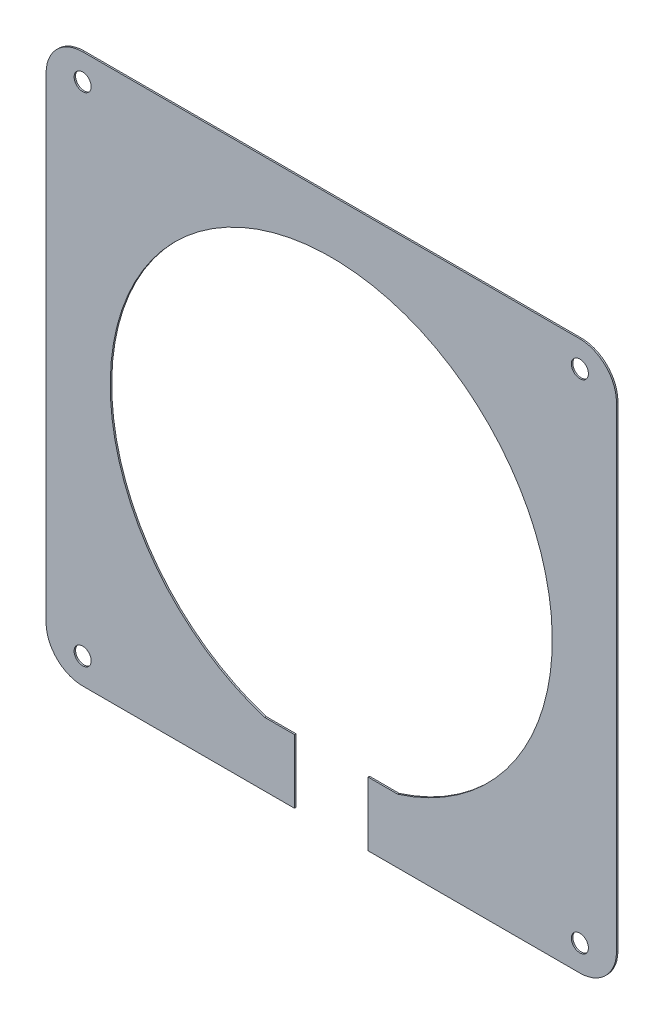
ISO-10303-21;
HEADER;
FILE_DESCRIPTION(('STEP AP214'),'2;1');
FILE_NAME('part.step','',(''),(''),'','','');
FILE_SCHEMA(('AUTOMOTIVE_DESIGN { 1 0 10303 214 1 1 1 1 }'));
ENDSEC;
DATA;
#1=APPLICATION_CONTEXT('core data for automotive mechanical design processes');
#2=APPLICATION_PROTOCOL_DEFINITION('international standard','automotive_design',2000,#1);
#3=PRODUCT_CONTEXT('',#1,'mechanical');
#4=PRODUCT('Part','Part','',(#3));
#5=PRODUCT_RELATED_PRODUCT_CATEGORY('part','',(#4));
#6=PRODUCT_DEFINITION_FORMATION('','',#4);
#7=PRODUCT_DEFINITION_CONTEXT('part definition',#1,'design');
#8=PRODUCT_DEFINITION('design','',#6,#7);
#9=PRODUCT_DEFINITION_SHAPE('','',#8);
#10=(LENGTH_UNIT() NAMED_UNIT(*) SI_UNIT(.MILLI.,.METRE.));
#11=(NAMED_UNIT(*) PLANE_ANGLE_UNIT() SI_UNIT($,.RADIAN.));
#12=(NAMED_UNIT(*) SI_UNIT($,.STERADIAN.) SOLID_ANGLE_UNIT());
#13=UNCERTAINTY_MEASURE_WITH_UNIT(LENGTH_MEASURE(1.E-05),#10,'distance_accuracy_value','');
#14=(GEOMETRIC_REPRESENTATION_CONTEXT(3) GLOBAL_UNCERTAINTY_ASSIGNED_CONTEXT((#13)) GLOBAL_UNIT_ASSIGNED_CONTEXT((#10,
#11,#12)) REPRESENTATION_CONTEXT('',''));
#15=CARTESIAN_POINT('',(0.,0.,0.));
#16=DIRECTION('',(0.,0.,1.));
#17=DIRECTION('',(1.,0.,0.));
#18=AXIS2_PLACEMENT_3D('',#15,#16,#17);
#19=CARTESIAN_POINT('',(0.,0.,0.254));
#20=DIRECTION('',(0.,0.,-1.));
#21=DIRECTION('',(-1.,0.,0.));
#22=AXIS2_PLACEMENT_3D('',#19,#20,#21);
#23=CYLINDRICAL_SURFACE('',#22,38.227);
#24=CARTESIAN_POINT('',(0.,0.,0.));
#25=DIRECTION('',(0.,0.,1.));
#26=DIRECTION('',(1.,0.,0.));
#27=AXIS2_PLACEMENT_3D('',#24,#25,#26);
#28=CIRCLE('',#27,38.227);
#29=CARTESIAN_POINT('',(11.5,-36.4561864297406,0.));
#30=VERTEX_POINT('',#29);
#31=CARTESIAN_POINT('',(-11.5,-36.4561864297406,0.));
#32=VERTEX_POINT('',#31);
#33=EDGE_CURVE('E153',#30,#32,#28,.T.);
#34=ORIENTED_EDGE('',*,*,#33,.F.);
#35=DIRECTION('',(0.,0.,-1.));
#36=VECTOR('',#35,1.);
#37=CARTESIAN_POINT('',(11.5,-36.4561864297406,0.254));
#38=LINE('',#37,#36);
#39=CARTESIAN_POINT('',(11.5,-36.4561864297406,0.254));
#40=VERTEX_POINT('',#39);
#41=EDGE_CURVE('E148',#40,#30,#38,.T.);
#42=ORIENTED_EDGE('',*,*,#41,.F.);
#43=CARTESIAN_POINT('',(0.,0.,0.254));
#44=DIRECTION('',(0.,0.,1.));
#45=DIRECTION('',(1.,0.,0.));
#46=AXIS2_PLACEMENT_3D('',#43,#44,#45);
#47=CIRCLE('',#46,38.227);
#48=CARTESIAN_POINT('',(-11.5,-36.4561864297406,0.254));
#49=VERTEX_POINT('',#48);
#50=EDGE_CURVE('E150',#40,#49,#47,.T.);
#51=ORIENTED_EDGE('',*,*,#50,.T.);
#52=DIRECTION('',(0.,0.,-1.));
#53=VECTOR('',#52,1.);
#54=CARTESIAN_POINT('',(-11.5,-36.4561864297406,0.254));
#55=LINE('',#54,#53);
#56=EDGE_CURVE('E203',#49,#32,#55,.T.);
#57=ORIENTED_EDGE('',*,*,#56,.T.);
#58=EDGE_LOOP('',(#34,#42,#51,#57));
#59=FACE_BOUND('',#58,.T.);
#60=ADVANCED_FACE('F45',(#59),#23,.F.);
#61=CARTESIAN_POINT('',(0.,-36.4561864297406,0.254));
#62=DIRECTION('',(0.,1.,0.));
#63=DIRECTION('',(0.,0.,1.));
#64=AXIS2_PLACEMENT_3D('',#61,#62,#63);
#65=PLANE('',#64);
#66=DIRECTION('',(1.,0.,0.));
#67=VECTOR('',#66,1.);
#68=CARTESIAN_POINT('',(0.,-36.4561864297406,0.));
#69=LINE('',#68,#67);
#70=CARTESIAN_POINT('',(6.35000000000001,-36.4561864297406,0.));
#71=VERTEX_POINT('',#70);
#72=EDGE_CURVE('E222',#71,#30,#69,.T.);
#73=ORIENTED_EDGE('',*,*,#72,.F.);
#74=DIRECTION('',(0.,0.,-1.));
#75=VECTOR('',#74,1.);
#76=CARTESIAN_POINT('',(6.35000000000001,-36.4561864297406,0.254));
#77=LINE('',#76,#75);
#78=CARTESIAN_POINT('',(6.35000000000001,-36.4561864297406,0.254));
#79=VERTEX_POINT('',#78);
#80=EDGE_CURVE('E160',#79,#71,#77,.T.);
#81=ORIENTED_EDGE('',*,*,#80,.F.);
#82=DIRECTION('',(1.,0.,0.));
#83=VECTOR('',#82,1.);
#84=CARTESIAN_POINT('',(0.,-36.4561864297406,0.254));
#85=LINE('',#84,#83);
#86=EDGE_CURVE('E166',#79,#40,#85,.T.);
#87=ORIENTED_EDGE('',*,*,#86,.T.);
#88=ORIENTED_EDGE('',*,*,#41,.T.);
#89=EDGE_LOOP('',(#73,#81,#87,#88));
#90=FACE_BOUND('',#89,.T.);
#91=ADVANCED_FACE('F173',(#90),#65,.T.);
#92=CARTESIAN_POINT('',(6.35000000000001,0.,0.254));
#93=DIRECTION('',(1.,0.,0.));
#94=DIRECTION('',(0.,0.,-1.));
#95=AXIS2_PLACEMENT_3D('',#92,#93,#94);
#96=PLANE('',#95);
#97=DIRECTION('',(0.,-1.,0.));
#98=VECTOR('',#97,1.);
#99=CARTESIAN_POINT('',(6.35000000000001,0.,0.));
#100=LINE('',#99,#98);
#101=CARTESIAN_POINT('',(6.35000000000001,-47.5,0.));
#102=VERTEX_POINT('',#101);
#103=EDGE_CURVE('E225',#71,#102,#100,.T.);
#104=ORIENTED_EDGE('',*,*,#103,.T.);
#105=DIRECTION('',(0.,0.,-1.));
#106=VECTOR('',#105,1.);
#107=CARTESIAN_POINT('',(6.35000000000001,-47.5,0.254));
#108=LINE('',#107,#106);
#109=CARTESIAN_POINT('',(6.35000000000001,-47.5,0.254));
#110=VERTEX_POINT('',#109);
#111=EDGE_CURVE('E264',#110,#102,#108,.T.);
#112=ORIENTED_EDGE('',*,*,#111,.F.);
#113=DIRECTION('',(0.,-1.,0.));
#114=VECTOR('',#113,1.);
#115=CARTESIAN_POINT('',(6.35000000000001,0.,0.254));
#116=LINE('',#115,#114);
#117=EDGE_CURVE('E176',#79,#110,#116,.T.);
#118=ORIENTED_EDGE('',*,*,#117,.F.);
#119=ORIENTED_EDGE('',*,*,#80,.T.);
#120=EDGE_LOOP('',(#104,#112,#118,#119));
#121=FACE_BOUND('',#120,.T.);
#122=ADVANCED_FACE('F332',(#121),#96,.F.);
#123=CARTESIAN_POINT('',(0.,-47.5,0.254));
#124=DIRECTION('',(0.,1.,0.));
#125=DIRECTION('',(0.,0.,1.));
#126=AXIS2_PLACEMENT_3D('',#123,#124,#125);
#127=PLANE('',#126);
#128=DIRECTION('',(1.,0.,0.));
#129=VECTOR('',#128,1.);
#130=CARTESIAN_POINT('',(0.,-47.5,0.));
#131=LINE('',#130,#129);
#132=CARTESIAN_POINT('',(42.975,-47.5,0.));
#133=VERTEX_POINT('',#132);
#134=EDGE_CURVE('E229',#102,#133,#131,.T.);
#135=ORIENTED_EDGE('',*,*,#134,.T.);
#136=DIRECTION('',(0.,0.,-1.));
#137=VECTOR('',#136,1.);
#138=CARTESIAN_POINT('',(42.975,-47.5,0.254));
#139=LINE('',#138,#137);
#140=CARTESIAN_POINT('',(42.975,-47.5,0.254));
#141=VERTEX_POINT('',#140);
#142=EDGE_CURVE('E310',#133,#141,#139,.F.);
#143=ORIENTED_EDGE('',*,*,#142,.T.);
#144=DIRECTION('',(1.,0.,0.));
#145=VECTOR('',#144,1.);
#146=CARTESIAN_POINT('',(0.,-47.5,0.254));
#147=LINE('',#146,#145);
#148=EDGE_CURVE('E179',#110,#141,#147,.T.);
#149=ORIENTED_EDGE('',*,*,#148,.F.);
#150=ORIENTED_EDGE('',*,*,#111,.T.);
#151=EDGE_LOOP('',(#135,#143,#149,#150));
#152=FACE_BOUND('',#151,.T.);
#153=ADVANCED_FACE('F431',(#152),#127,.F.);
#154=CARTESIAN_POINT('',(49.325,0.,0.254));
#155=DIRECTION('',(1.,0.,0.));
#156=DIRECTION('',(0.,1.,0.));
#157=AXIS2_PLACEMENT_3D('',#154,#155,#156);
#158=PLANE('',#157);
#159=DIRECTION('',(0.,-1.,0.));
#160=VECTOR('',#159,1.);
#161=CARTESIAN_POINT('',(49.325,0.,0.254));
#162=LINE('',#161,#160);
#163=CARTESIAN_POINT('',(49.325,41.15,0.254));
#164=VERTEX_POINT('',#163);
#165=CARTESIAN_POINT('',(49.325,-41.15,0.254));
#166=VERTEX_POINT('',#165);
#167=EDGE_CURVE('E186',#164,#166,#162,.T.);
#168=ORIENTED_EDGE('',*,*,#167,.T.);
#169=DIRECTION('',(0.,0.,-1.));
#170=VECTOR('',#169,1.);
#171=CARTESIAN_POINT('',(49.325,-41.15,0.));
#172=LINE('',#171,#170);
#173=CARTESIAN_POINT('',(49.325,-41.15,0.));
#174=VERTEX_POINT('',#173);
#175=EDGE_CURVE('E306',#166,#174,#172,.T.);
#176=ORIENTED_EDGE('',*,*,#175,.T.);
#177=DIRECTION('',(0.,-1.,0.));
#178=VECTOR('',#177,1.);
#179=CARTESIAN_POINT('',(49.325,0.,0.));
#180=LINE('',#179,#178);
#181=CARTESIAN_POINT('',(49.325,41.15,0.));
#182=VERTEX_POINT('',#181);
#183=EDGE_CURVE('E233',#182,#174,#180,.T.);
#184=ORIENTED_EDGE('',*,*,#183,.F.);
#185=DIRECTION('',(0.,0.,-1.));
#186=VECTOR('',#185,1.);
#187=CARTESIAN_POINT('',(49.325,41.15,0.254));
#188=LINE('',#187,#186);
#189=EDGE_CURVE('E303',#182,#164,#188,.F.);
#190=ORIENTED_EDGE('',*,*,#189,.T.);
#191=EDGE_LOOP('',(#168,#176,#184,#190));
#192=FACE_BOUND('',#191,.T.);
#193=ADVANCED_FACE('F341',(#192),#158,.T.);
#194=CARTESIAN_POINT('',(0.,47.5,0.254));
#195=DIRECTION('',(0.,1.,0.));
#196=DIRECTION('',(0.,0.,1.));
#197=AXIS2_PLACEMENT_3D('',#194,#195,#196);
#198=PLANE('',#197);
#199=DIRECTION('',(1.,0.,0.));
#200=VECTOR('',#199,1.);
#201=CARTESIAN_POINT('',(0.,47.5,0.254));
#202=LINE('',#201,#200);
#203=CARTESIAN_POINT('',(-42.975,47.5,0.254));
#204=VERTEX_POINT('',#203);
#205=CARTESIAN_POINT('',(42.975,47.5,0.254));
#206=VERTEX_POINT('',#205);
#207=EDGE_CURVE('E191',#204,#206,#202,.T.);
#208=ORIENTED_EDGE('',*,*,#207,.T.);
#209=DIRECTION('',(0.,0.,-1.));
#210=VECTOR('',#209,1.);
#211=CARTESIAN_POINT('',(42.975,47.5,0.254));
#212=LINE('',#211,#210);
#213=CARTESIAN_POINT('',(42.975,47.5,0.));
#214=VERTEX_POINT('',#213);
#215=EDGE_CURVE('E11',#206,#214,#212,.T.);
#216=ORIENTED_EDGE('',*,*,#215,.T.);
#217=DIRECTION('',(1.,0.,0.));
#218=VECTOR('',#217,1.);
#219=CARTESIAN_POINT('',(0.,47.5,0.));
#220=LINE('',#219,#218);
#221=CARTESIAN_POINT('',(-42.975,47.5,0.));
#222=VERTEX_POINT('',#221);
#223=EDGE_CURVE('E238',#222,#214,#220,.T.);
#224=ORIENTED_EDGE('',*,*,#223,.F.);
#225=DIRECTION('',(0.,0.,-1.));
#226=VECTOR('',#225,1.);
#227=CARTESIAN_POINT('',(-42.975,47.5,0.254));
#228=LINE('',#227,#226);
#229=EDGE_CURVE('E54',#222,#204,#228,.F.);
#230=ORIENTED_EDGE('',*,*,#229,.T.);
#231=EDGE_LOOP('',(#208,#216,#224,#230));
#232=FACE_BOUND('',#231,.T.);
#233=ADVANCED_FACE('F346',(#232),#198,.T.);
#234=CARTESIAN_POINT('',(-49.325,0.,0.254));
#235=DIRECTION('',(1.,0.,0.));
#236=DIRECTION('',(0.,1.,0.));
#237=AXIS2_PLACEMENT_3D('',#234,#235,#236);
#238=PLANE('',#237);
#239=DIRECTION('',(0.,-1.,0.));
#240=VECTOR('',#239,1.);
#241=CARTESIAN_POINT('',(-49.325,0.,0.));
#242=LINE('',#241,#240);
#243=CARTESIAN_POINT('',(-49.325,41.15,0.));
#244=VERTEX_POINT('',#243);
#245=CARTESIAN_POINT('',(-49.325,-41.15,0.));
#246=VERTEX_POINT('',#245);
#247=EDGE_CURVE('E242',#244,#246,#242,.T.);
#248=ORIENTED_EDGE('',*,*,#247,.T.);
#249=DIRECTION('',(0.,0.,-1.));
#250=VECTOR('',#249,1.);
#251=CARTESIAN_POINT('',(-49.325,-41.15,0.254));
#252=LINE('',#251,#250);
#253=CARTESIAN_POINT('',(-49.325,-41.15,0.254));
#254=VERTEX_POINT('',#253);
#255=EDGE_CURVE('E289',#246,#254,#252,.F.);
#256=ORIENTED_EDGE('',*,*,#255,.T.);
#257=DIRECTION('',(0.,-1.,0.));
#258=VECTOR('',#257,1.);
#259=CARTESIAN_POINT('',(-49.325,0.,0.254));
#260=LINE('',#259,#258);
#261=CARTESIAN_POINT('',(-49.325,41.15,0.254));
#262=VERTEX_POINT('',#261);
#263=EDGE_CURVE('E194',#262,#254,#260,.T.);
#264=ORIENTED_EDGE('',*,*,#263,.F.);
#265=DIRECTION('',(0.,0.,-1.));
#266=VECTOR('',#265,1.);
#267=CARTESIAN_POINT('',(-49.325,41.15,0.));
#268=LINE('',#267,#266);
#269=EDGE_CURVE('E285',#262,#244,#268,.T.);
#270=ORIENTED_EDGE('',*,*,#269,.T.);
#271=EDGE_LOOP('',(#248,#256,#264,#270));
#272=FACE_BOUND('',#271,.T.);
#273=ADVANCED_FACE('F353',(#272),#238,.F.);
#274=CARTESIAN_POINT('',(-42.975,-47.5,0.254));
#275=VERTEX_POINT('',#274);
#276=CARTESIAN_POINT('',(-6.34999999999999,-47.5,0.254));
#277=VERTEX_POINT('',#276);
#278=EDGE_CURVE('E187',#275,#277,#147,.T.);
#279=ORIENTED_EDGE('',*,*,#278,.F.);
#280=DIRECTION('',(0.,0.,-1.));
#281=VECTOR('',#280,1.);
#282=CARTESIAN_POINT('',(-42.975,-47.5,0.254));
#283=LINE('',#282,#281);
#284=CARTESIAN_POINT('',(-42.975,-47.5,0.));
#285=VERTEX_POINT('',#284);
#286=EDGE_CURVE('E159',#275,#285,#283,.T.);
#287=ORIENTED_EDGE('',*,*,#286,.T.);
#288=CARTESIAN_POINT('',(-6.34999999999999,-47.5,0.));
#289=VERTEX_POINT('',#288);
#290=EDGE_CURVE('E234',#285,#289,#131,.T.);
#291=ORIENTED_EDGE('',*,*,#290,.T.);
#292=DIRECTION('',(0.,0.,-1.));
#293=VECTOR('',#292,1.);
#294=CARTESIAN_POINT('',(-6.34999999999999,-47.5,0.254));
#295=LINE('',#294,#293);
#296=EDGE_CURVE('E260',#277,#289,#295,.T.);
#297=ORIENTED_EDGE('',*,*,#296,.F.);
#298=EDGE_LOOP('',(#279,#287,#291,#297));
#299=FACE_BOUND('',#298,.T.);
#300=ADVANCED_FACE('F319',(#299),#127,.F.);
#301=CARTESIAN_POINT('',(-6.34999999999999,0.,0.254));
#302=DIRECTION('',(1.,0.,0.));
#303=DIRECTION('',(0.,1.,0.));
#304=AXIS2_PLACEMENT_3D('',#301,#302,#303);
#305=PLANE('',#304);
#306=DIRECTION('',(0.,-1.,0.));
#307=VECTOR('',#306,1.);
#308=CARTESIAN_POINT('',(-6.34999999999999,0.,0.));
#309=LINE('',#308,#307);
#310=CARTESIAN_POINT('',(-6.34999999999999,-36.4561864297406,0.));
#311=VERTEX_POINT('',#310);
#312=EDGE_CURVE('E246',#311,#289,#309,.T.);
#313=ORIENTED_EDGE('',*,*,#312,.F.);
#314=DIRECTION('',(0.,0.,-1.));
#315=VECTOR('',#314,1.);
#316=CARTESIAN_POINT('',(-6.34999999999999,-36.4561864297406,0.254));
#317=LINE('',#316,#315);
#318=CARTESIAN_POINT('',(-6.34999999999999,-36.4561864297406,0.254));
#319=VERTEX_POINT('',#318);
#320=EDGE_CURVE('E257',#319,#311,#317,.T.);
#321=ORIENTED_EDGE('',*,*,#320,.F.);
#322=DIRECTION('',(0.,-1.,0.));
#323=VECTOR('',#322,1.);
#324=CARTESIAN_POINT('',(-6.34999999999999,0.,0.254));
#325=LINE('',#324,#323);
#326=EDGE_CURVE('E197',#319,#277,#325,.T.);
#327=ORIENTED_EDGE('',*,*,#326,.T.);
#328=ORIENTED_EDGE('',*,*,#296,.T.);
#329=EDGE_LOOP('',(#313,#321,#327,#328));
#330=FACE_BOUND('',#329,.T.);
#331=ADVANCED_FACE('F323',(#330),#305,.T.);
#332=CARTESIAN_POINT('',(-43.,43.,0.254));
#333=DIRECTION('',(0.,0.,-1.));
#334=DIRECTION('',(-1.,0.,0.));
#335=AXIS2_PLACEMENT_3D('',#332,#333,#334);
#336=CYLINDRICAL_SURFACE('',#335,1.475);
#337=CARTESIAN_POINT('',(-43.,43.,0.254));
#338=DIRECTION('',(0.,0.,1.));
#339=DIRECTION('',(1.,0.,0.));
#340=AXIS2_PLACEMENT_3D('',#337,#338,#339);
#341=CIRCLE('',#340,1.475);
#342=CARTESIAN_POINT('',(-41.525,43.,0.254));
#343=VERTEX_POINT('',#342);
#344=EDGE_CURVE('E171',#343,#343,#341,.T.);
#345=ORIENTED_EDGE('',*,*,#344,.T.);
#346=EDGE_LOOP('',(#345));
#347=FACE_BOUND('',#346,.T.);
#348=CARTESIAN_POINT('',(-43.,43.,0.));
#349=DIRECTION('',(0.,0.,1.));
#350=DIRECTION('',(1.,0.,0.));
#351=AXIS2_PLACEMENT_3D('',#348,#349,#350);
#352=CIRCLE('',#351,1.475);
#353=CARTESIAN_POINT('',(-41.525,43.,0.));
#354=VERTEX_POINT('',#353);
#355=EDGE_CURVE('E216',#354,#354,#352,.T.);
#356=ORIENTED_EDGE('',*,*,#355,.F.);
#357=EDGE_LOOP('',(#356));
#358=FACE_BOUND('',#357,.T.);
#359=ADVANCED_FACE('F375',(#347,#358),#336,.F.);
#360=CARTESIAN_POINT('',(43.,43.,0.254));
#361=DIRECTION('',(0.,0.,-1.));
#362=DIRECTION('',(-1.,0.,0.));
#363=AXIS2_PLACEMENT_3D('',#360,#361,#362);
#364=CYLINDRICAL_SURFACE('',#363,1.475);
#365=CARTESIAN_POINT('',(43.,43.,0.254));
#366=DIRECTION('',(0.,0.,1.));
#367=DIRECTION('',(1.,0.,0.));
#368=AXIS2_PLACEMENT_3D('',#365,#366,#367);
#369=CIRCLE('',#368,1.475);
#370=CARTESIAN_POINT('',(44.475,43.,0.254));
#371=VERTEX_POINT('',#370);
#372=EDGE_CURVE('E412',#371,#371,#369,.T.);
#373=ORIENTED_EDGE('',*,*,#372,.T.);
#374=EDGE_LOOP('',(#373));
#375=FACE_BOUND('',#374,.T.);
#376=CARTESIAN_POINT('',(43.,43.,0.));
#377=DIRECTION('',(0.,0.,1.));
#378=DIRECTION('',(1.,0.,0.));
#379=AXIS2_PLACEMENT_3D('',#376,#377,#378);
#380=CIRCLE('',#379,1.475);
#381=CARTESIAN_POINT('',(44.475,43.,0.));
#382=VERTEX_POINT('',#381);
#383=EDGE_CURVE('E212',#382,#382,#380,.T.);
#384=ORIENTED_EDGE('',*,*,#383,.F.);
#385=EDGE_LOOP('',(#384));
#386=FACE_BOUND('',#385,.T.);
#387=ADVANCED_FACE('F378',(#375,#386),#364,.F.);
#388=CARTESIAN_POINT('',(43.,-43.,0.254));
#389=DIRECTION('',(0.,0.,-1.));
#390=DIRECTION('',(-1.,0.,0.));
#391=AXIS2_PLACEMENT_3D('',#388,#389,#390);
#392=CYLINDRICAL_SURFACE('',#391,1.475);
#393=CARTESIAN_POINT('',(43.,-43.,0.254));
#394=DIRECTION('',(0.,0.,1.));
#395=DIRECTION('',(1.,0.,0.));
#396=AXIS2_PLACEMENT_3D('',#393,#394,#395);
#397=CIRCLE('',#396,1.475);
#398=CARTESIAN_POINT('',(44.475,-43.,0.254));
#399=VERTEX_POINT('',#398);
#400=EDGE_CURVE('E408',#399,#399,#397,.T.);
#401=ORIENTED_EDGE('',*,*,#400,.T.);
#402=EDGE_LOOP('',(#401));
#403=FACE_BOUND('',#402,.T.);
#404=CARTESIAN_POINT('',(43.,-43.,0.));
#405=DIRECTION('',(0.,0.,1.));
#406=DIRECTION('',(1.,0.,0.));
#407=AXIS2_PLACEMENT_3D('',#404,#405,#406);
#408=CIRCLE('',#407,1.475);
#409=CARTESIAN_POINT('',(44.475,-43.,0.));
#410=VERTEX_POINT('',#409);
#411=EDGE_CURVE('E208',#410,#410,#408,.T.);
#412=ORIENTED_EDGE('',*,*,#411,.F.);
#413=EDGE_LOOP('',(#412));
#414=FACE_BOUND('',#413,.T.);
#415=ADVANCED_FACE('F382',(#403,#414),#392,.F.);
#416=CARTESIAN_POINT('',(-43.,-43.,0.254));
#417=DIRECTION('',(0.,0.,-1.));
#418=DIRECTION('',(-1.,0.,0.));
#419=AXIS2_PLACEMENT_3D('',#416,#417,#418);
#420=CYLINDRICAL_SURFACE('',#419,1.475);
#421=CARTESIAN_POINT('',(-43.,-43.,0.254));
#422=DIRECTION('',(0.,0.,1.));
#423=DIRECTION('',(1.,0.,0.));
#424=AXIS2_PLACEMENT_3D('',#421,#422,#423);
#425=CIRCLE('',#424,1.475);
#426=CARTESIAN_POINT('',(-41.525,-43.,0.254));
#427=VERTEX_POINT('',#426);
#428=EDGE_CURVE('E254',#427,#427,#425,.T.);
#429=ORIENTED_EDGE('',*,*,#428,.T.);
#430=EDGE_LOOP('',(#429));
#431=FACE_BOUND('',#430,.T.);
#432=CARTESIAN_POINT('',(-43.,-43.,0.));
#433=DIRECTION('',(0.,0.,1.));
#434=DIRECTION('',(1.,0.,0.));
#435=AXIS2_PLACEMENT_3D('',#432,#433,#434);
#436=CIRCLE('',#435,1.475);
#437=CARTESIAN_POINT('',(-41.525,-43.,0.));
#438=VERTEX_POINT('',#437);
#439=EDGE_CURVE('E204',#438,#438,#436,.T.);
#440=ORIENTED_EDGE('',*,*,#439,.F.);
#441=EDGE_LOOP('',(#440));
#442=FACE_BOUND('',#441,.T.);
#443=ADVANCED_FACE('F385',(#431,#442),#420,.F.);
#444=CARTESIAN_POINT('',(0.,-36.4561864297406,0.254));
#445=DIRECTION('',(0.,1.,0.));
#446=DIRECTION('',(0.,0.,1.));
#447=AXIS2_PLACEMENT_3D('',#444,#445,#446);
#448=PLANE('',#447);
#449=DIRECTION('',(1.,0.,0.));
#450=VECTOR('',#449,1.);
#451=CARTESIAN_POINT('',(0.,-36.4561864297406,0.));
#452=LINE('',#451,#450);
#453=EDGE_CURVE('E250',#32,#311,#452,.T.);
#454=ORIENTED_EDGE('',*,*,#453,.F.);
#455=ORIENTED_EDGE('',*,*,#56,.F.);
#456=DIRECTION('',(1.,0.,0.));
#457=VECTOR('',#456,1.);
#458=CARTESIAN_POINT('',(0.,-36.4561864297406,0.254));
#459=LINE('',#458,#457);
#460=EDGE_CURVE('E169',#49,#319,#459,.T.);
#461=ORIENTED_EDGE('',*,*,#460,.T.);
#462=ORIENTED_EDGE('',*,*,#320,.T.);
#463=EDGE_LOOP('',(#454,#455,#461,#462));
#464=FACE_BOUND('',#463,.T.);
#465=ADVANCED_FACE('F326',(#464),#448,.T.);
#466=CARTESIAN_POINT('',(0.,0.,0.254));
#467=DIRECTION('',(0.,0.,1.));
#468=DIRECTION('',(1.,0.,0.));
#469=AXIS2_PLACEMENT_3D('',#466,#467,#468);
#470=PLANE('',#469);
#471=ORIENTED_EDGE('',*,*,#428,.F.);
#472=EDGE_LOOP('',(#471));
#473=FACE_BOUND('',#472,.T.);
#474=ORIENTED_EDGE('',*,*,#400,.F.);
#475=EDGE_LOOP('',(#474));
#476=FACE_BOUND('',#475,.T.);
#477=ORIENTED_EDGE('',*,*,#372,.F.);
#478=EDGE_LOOP('',(#477));
#479=FACE_BOUND('',#478,.T.);
#480=ORIENTED_EDGE('',*,*,#344,.F.);
#481=EDGE_LOOP('',(#480));
#482=FACE_BOUND('',#481,.T.);
#483=ORIENTED_EDGE('',*,*,#263,.T.);
#484=CARTESIAN_POINT('',(-42.975,-41.15,0.254));
#485=DIRECTION('',(0.,0.,1.));
#486=DIRECTION('',(1.,0.,0.));
#487=AXIS2_PLACEMENT_3D('',#484,#485,#486);
#488=CIRCLE('',#487,6.35);
#489=EDGE_CURVE('E300',#254,#275,#488,.T.);
#490=ORIENTED_EDGE('',*,*,#489,.T.);
#491=ORIENTED_EDGE('',*,*,#278,.T.);
#492=ORIENTED_EDGE('',*,*,#326,.F.);
#493=ORIENTED_EDGE('',*,*,#460,.F.);
#494=ORIENTED_EDGE('',*,*,#50,.F.);
#495=ORIENTED_EDGE('',*,*,#86,.F.);
#496=ORIENTED_EDGE('',*,*,#117,.T.);
#497=ORIENTED_EDGE('',*,*,#148,.T.);
#498=CARTESIAN_POINT('',(42.975,-41.15,0.254));
#499=DIRECTION('',(0.,0.,1.));
#500=DIRECTION('',(1.,0.,0.));
#501=AXIS2_PLACEMENT_3D('',#498,#499,#500);
#502=CIRCLE('',#501,6.35);
#503=EDGE_CURVE('E297',#141,#166,#502,.T.);
#504=ORIENTED_EDGE('',*,*,#503,.T.);
#505=ORIENTED_EDGE('',*,*,#167,.F.);
#506=CARTESIAN_POINT('',(42.975,41.15,0.254));
#507=DIRECTION('',(0.,0.,1.));
#508=DIRECTION('',(1.,0.,0.));
#509=AXIS2_PLACEMENT_3D('',#506,#507,#508);
#510=CIRCLE('',#509,6.35);
#511=EDGE_CURVE('E61',#164,#206,#510,.T.);
#512=ORIENTED_EDGE('',*,*,#511,.T.);
#513=ORIENTED_EDGE('',*,*,#207,.F.);
#514=CARTESIAN_POINT('',(-42.975,41.15,0.254));
#515=DIRECTION('',(0.,0.,1.));
#516=DIRECTION('',(1.,0.,0.));
#517=AXIS2_PLACEMENT_3D('',#514,#515,#516);
#518=CIRCLE('',#517,6.35);
#519=EDGE_CURVE('E292',#204,#262,#518,.T.);
#520=ORIENTED_EDGE('',*,*,#519,.T.);
#521=EDGE_LOOP('',(#483,#490,#491,#492,#493,#494,#495,#496,#497,#504,#505,#512,#513,#520));
#522=FACE_BOUND('',#521,.T.);
#523=ADVANCED_FACE('F164',(#473,#476,#479,#482,#522),#470,.T.);
#524=CARTESIAN_POINT('',(0.,0.,0.));
#525=DIRECTION('',(0.,0.,1.));
#526=DIRECTION('',(1.,0.,0.));
#527=AXIS2_PLACEMENT_3D('',#524,#525,#526);
#528=PLANE('',#527);
#529=ORIENTED_EDGE('',*,*,#439,.T.);
#530=EDGE_LOOP('',(#529));
#531=FACE_BOUND('',#530,.T.);
#532=ORIENTED_EDGE('',*,*,#411,.T.);
#533=EDGE_LOOP('',(#532));
#534=FACE_BOUND('',#533,.T.);
#535=ORIENTED_EDGE('',*,*,#383,.T.);
#536=EDGE_LOOP('',(#535));
#537=FACE_BOUND('',#536,.T.);
#538=ORIENTED_EDGE('',*,*,#355,.T.);
#539=EDGE_LOOP('',(#538));
#540=FACE_BOUND('',#539,.T.);
#541=ORIENTED_EDGE('',*,*,#290,.F.);
#542=CARTESIAN_POINT('',(-42.975,-41.15,0.));
#543=DIRECTION('',(0.,0.,1.));
#544=DIRECTION('',(1.,0.,0.));
#545=AXIS2_PLACEMENT_3D('',#542,#543,#544);
#546=CIRCLE('',#545,6.35);
#547=EDGE_CURVE('E282',#285,#246,#546,.F.);
#548=ORIENTED_EDGE('',*,*,#547,.T.);
#549=ORIENTED_EDGE('',*,*,#247,.F.);
#550=CARTESIAN_POINT('',(-42.975,41.15,0.));
#551=DIRECTION('',(0.,0.,1.));
#552=DIRECTION('',(1.,0.,0.));
#553=AXIS2_PLACEMENT_3D('',#550,#551,#552);
#554=CIRCLE('',#553,6.35);
#555=EDGE_CURVE('E273',#244,#222,#554,.F.);
#556=ORIENTED_EDGE('',*,*,#555,.T.);
#557=ORIENTED_EDGE('',*,*,#223,.T.);
#558=CARTESIAN_POINT('',(42.975,41.15,0.));
#559=DIRECTION('',(0.,0.,1.));
#560=DIRECTION('',(1.,0.,0.));
#561=AXIS2_PLACEMENT_3D('',#558,#559,#560);
#562=CIRCLE('',#561,6.35);
#563=EDGE_CURVE('E276',#214,#182,#562,.F.);
#564=ORIENTED_EDGE('',*,*,#563,.T.);
#565=ORIENTED_EDGE('',*,*,#183,.T.);
#566=CARTESIAN_POINT('',(42.975,-41.15,0.));
#567=DIRECTION('',(0.,0.,1.));
#568=DIRECTION('',(1.,0.,0.));
#569=AXIS2_PLACEMENT_3D('',#566,#567,#568);
#570=CIRCLE('',#569,6.35);
#571=EDGE_CURVE('E279',#174,#133,#570,.F.);
#572=ORIENTED_EDGE('',*,*,#571,.T.);
#573=ORIENTED_EDGE('',*,*,#134,.F.);
#574=ORIENTED_EDGE('',*,*,#103,.F.);
#575=ORIENTED_EDGE('',*,*,#72,.T.);
#576=ORIENTED_EDGE('',*,*,#33,.T.);
#577=ORIENTED_EDGE('',*,*,#453,.T.);
#578=ORIENTED_EDGE('',*,*,#312,.T.);
#579=EDGE_LOOP('',(#541,#548,#549,#556,#557,#564,#565,#572,#573,#574,#575,#576,#577,#578));
#580=FACE_BOUND('',#579,.T.);
#581=ADVANCED_FACE('F328',(#531,#534,#537,#540,#580),#528,.F.);
#582=CARTESIAN_POINT('',(-42.975,-41.15,0.254));
#583=DIRECTION('',(0.,0.,-1.));
#584=DIRECTION('',(-1.,0.,0.));
#585=AXIS2_PLACEMENT_3D('',#582,#583,#584);
#586=CYLINDRICAL_SURFACE('',#585,6.35);
#587=ORIENTED_EDGE('',*,*,#489,.F.);
#588=ORIENTED_EDGE('',*,*,#255,.F.);
#589=ORIENTED_EDGE('',*,*,#547,.F.);
#590=ORIENTED_EDGE('',*,*,#286,.F.);
#591=EDGE_LOOP('',(#587,#588,#589,#590));
#592=FACE_BOUND('',#591,.T.);
#593=ADVANCED_FACE('F356',(#592),#586,.T.);
#594=CARTESIAN_POINT('',(42.975,-41.15,0.254));
#595=DIRECTION('',(0.,0.,1.));
#596=DIRECTION('',(1.,0.,0.));
#597=AXIS2_PLACEMENT_3D('',#594,#595,#596);
#598=CYLINDRICAL_SURFACE('',#597,6.35);
#599=ORIENTED_EDGE('',*,*,#503,.F.);
#600=ORIENTED_EDGE('',*,*,#142,.F.);
#601=ORIENTED_EDGE('',*,*,#571,.F.);
#602=ORIENTED_EDGE('',*,*,#175,.F.);
#603=EDGE_LOOP('',(#599,#600,#601,#602));
#604=FACE_BOUND('',#603,.T.);
#605=ADVANCED_FACE('F338',(#604),#598,.T.);
#606=CARTESIAN_POINT('',(42.975,41.15,0.254));
#607=DIRECTION('',(0.,0.,-1.));
#608=DIRECTION('',(-1.,0.,0.));
#609=AXIS2_PLACEMENT_3D('',#606,#607,#608);
#610=CYLINDRICAL_SURFACE('',#609,6.35);
#611=ORIENTED_EDGE('',*,*,#511,.F.);
#612=ORIENTED_EDGE('',*,*,#189,.F.);
#613=ORIENTED_EDGE('',*,*,#563,.F.);
#614=ORIENTED_EDGE('',*,*,#215,.F.);
#615=EDGE_LOOP('',(#611,#612,#613,#614));
#616=FACE_BOUND('',#615,.T.);
#617=ADVANCED_FACE('F345',(#616),#610,.T.);
#618=CARTESIAN_POINT('',(-42.975,41.15,0.254));
#619=DIRECTION('',(0.,0.,1.));
#620=DIRECTION('',(1.,0.,0.));
#621=AXIS2_PLACEMENT_3D('',#618,#619,#620);
#622=CYLINDRICAL_SURFACE('',#621,6.35);
#623=ORIENTED_EDGE('',*,*,#519,.F.);
#624=ORIENTED_EDGE('',*,*,#229,.F.);
#625=ORIENTED_EDGE('',*,*,#555,.F.);
#626=ORIENTED_EDGE('',*,*,#269,.F.);
#627=EDGE_LOOP('',(#623,#624,#625,#626));
#628=FACE_BOUND('',#627,.T.);
#629=ADVANCED_FACE('F47',(#628),#622,.T.);
#630=CLOSED_SHELL('',(#60,#91,#122,#153,#193,#233,#273,#300,#331,#359,#387,#415,#443,#465,#523,
#581,#593,#605,#617,#629));
#631=MANIFOLD_SOLID_BREP('B2',#630);
#632=ADVANCED_BREP_SHAPE_REPRESENTATION('',(#18,#631),#14);
#633=SHAPE_DEFINITION_REPRESENTATION(#9,#632);
ENDSEC;
END-ISO-10303-21;
